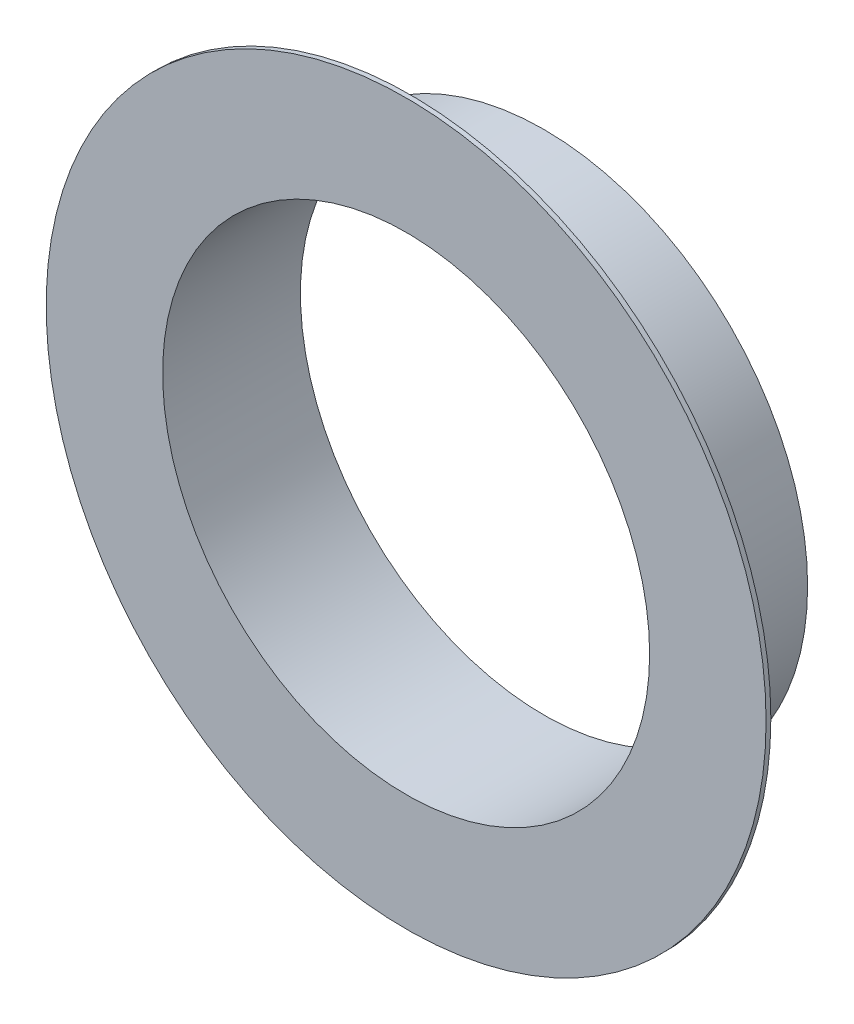
ISO-10303-21;
HEADER;
FILE_DESCRIPTION(('STEP AP214'),'2;1');
FILE_NAME('part.step','',(''),(''),'','','');
FILE_SCHEMA(('AUTOMOTIVE_DESIGN { 1 0 10303 214 1 1 1 1 }'));
ENDSEC;
DATA;
#1=APPLICATION_CONTEXT('core data for automotive mechanical design processes');
#2=APPLICATION_PROTOCOL_DEFINITION('international standard','automotive_design',2000,#1);
#3=PRODUCT_CONTEXT('',#1,'mechanical');
#4=PRODUCT('Part','Part','',(#3));
#5=PRODUCT_RELATED_PRODUCT_CATEGORY('part','',(#4));
#6=PRODUCT_DEFINITION_FORMATION('','',#4);
#7=PRODUCT_DEFINITION_CONTEXT('part definition',#1,'design');
#8=PRODUCT_DEFINITION('design','',#6,#7);
#9=PRODUCT_DEFINITION_SHAPE('','',#8);
#10=(LENGTH_UNIT() NAMED_UNIT(*) SI_UNIT(.MILLI.,.METRE.));
#11=(NAMED_UNIT(*) PLANE_ANGLE_UNIT() SI_UNIT($,.RADIAN.));
#12=(NAMED_UNIT(*) SI_UNIT($,.STERADIAN.) SOLID_ANGLE_UNIT());
#13=UNCERTAINTY_MEASURE_WITH_UNIT(LENGTH_MEASURE(1.E-05),#10,'distance_accuracy_value','');
#14=(GEOMETRIC_REPRESENTATION_CONTEXT(3) GLOBAL_UNCERTAINTY_ASSIGNED_CONTEXT((#13)) GLOBAL_UNIT_ASSIGNED_CONTEXT((#10,
#11,#12)) REPRESENTATION_CONTEXT('',''));
#15=CARTESIAN_POINT('',(0.,0.,0.));
#16=DIRECTION('',(0.,0.,1.));
#17=DIRECTION('',(1.,0.,0.));
#18=AXIS2_PLACEMENT_3D('',#15,#16,#17);
#19=CARTESIAN_POINT('',(0.,0.,58.));
#20=DIRECTION('',(0.,0.,1.));
#21=DIRECTION('',(1.,0.,0.));
#22=AXIS2_PLACEMENT_3D('',#19,#20,#21);
#23=PLANE('',#22);
#24=CARTESIAN_POINT('',(0.,0.,58.));
#25=DIRECTION('',(0.,0.,1.));
#26=DIRECTION('',(1.,0.,0.));
#27=AXIS2_PLACEMENT_3D('',#24,#25,#26);
#28=CIRCLE('',#27,151.521158387346);
#29=CARTESIAN_POINT('',(151.521158387346,0.,58.));
#30=VERTEX_POINT('',#29);
#31=EDGE_CURVE('E56',#30,#30,#28,.T.);
#32=ORIENTED_EDGE('',*,*,#31,.T.);
#33=EDGE_LOOP('',(#32));
#34=FACE_BOUND('',#33,.T.);
#35=CARTESIAN_POINT('',(0.,0.,58.));
#36=DIRECTION('',(0.,0.,1.));
#37=DIRECTION('',(1.,0.,0.));
#38=AXIS2_PLACEMENT_3D('',#35,#36,#37);
#39=CIRCLE('',#38,102.5);
#40=CARTESIAN_POINT('',(102.5,0.,58.));
#41=VERTEX_POINT('',#40);
#42=EDGE_CURVE('E103',#41,#41,#39,.T.);
#43=ORIENTED_EDGE('',*,*,#42,.F.);
#44=EDGE_LOOP('',(#43));
#45=FACE_BOUND('',#44,.T.);
#46=ADVANCED_FACE('F35',(#34,#45),#23,.T.);
#47=CARTESIAN_POINT('',(0.,0.,56.));
#48=DIRECTION('',(0.,0.,1.));
#49=DIRECTION('',(1.,0.,0.));
#50=AXIS2_PLACEMENT_3D('',#47,#48,#49);
#51=PLANE('',#50);
#52=CARTESIAN_POINT('',(0.,0.,56.));
#53=DIRECTION('',(0.,0.,1.));
#54=DIRECTION('',(1.,0.,0.));
#55=AXIS2_PLACEMENT_3D('',#52,#53,#54);
#56=CIRCLE('',#55,111.);
#57=CARTESIAN_POINT('',(111.,0.,56.));
#58=VERTEX_POINT('',#57);
#59=EDGE_CURVE('E10',#58,#58,#56,.T.);
#60=ORIENTED_EDGE('',*,*,#59,.T.);
#61=EDGE_LOOP('',(#60));
#62=FACE_BOUND('',#61,.T.);
#63=CARTESIAN_POINT('',(0.,0.,56.));
#64=DIRECTION('',(0.,0.,1.));
#65=DIRECTION('',(1.,0.,0.));
#66=AXIS2_PLACEMENT_3D('',#63,#64,#65);
#67=CIRCLE('',#66,151.521158387346);
#68=CARTESIAN_POINT('',(151.521158387346,0.,56.));
#69=VERTEX_POINT('',#68);
#70=EDGE_CURVE('E100',#69,#69,#67,.T.);
#71=ORIENTED_EDGE('',*,*,#70,.F.);
#72=EDGE_LOOP('',(#71));
#73=FACE_BOUND('',#72,.T.);
#74=ADVANCED_FACE('F112',(#62,#73),#51,.F.);
#75=CARTESIAN_POINT('',(0.,0.,58.));
#76=DIRECTION('',(0.,0.,-1.));
#77=DIRECTION('',(-1.,0.,0.));
#78=AXIS2_PLACEMENT_3D('',#75,#76,#77);
#79=CYLINDRICAL_SURFACE('',#78,151.521158387346);
#80=ORIENTED_EDGE('',*,*,#31,.F.);
#81=EDGE_LOOP('',(#80));
#82=FACE_BOUND('',#81,.T.);
#83=ORIENTED_EDGE('',*,*,#70,.T.);
#84=EDGE_LOOP('',(#83));
#85=FACE_BOUND('',#84,.T.);
#86=ADVANCED_FACE('F118',(#82,#85),#79,.T.);
#87=CARTESIAN_POINT('',(0.,0.,56.));
#88=DIRECTION('',(0.,0.,-1.));
#89=DIRECTION('',(-1.,0.,0.));
#90=AXIS2_PLACEMENT_3D('',#87,#88,#89);
#91=CYLINDRICAL_SURFACE('',#90,102.5);
#92=CARTESIAN_POINT('',(0.,0.,0.));
#93=DIRECTION('',(0.,0.,1.));
#94=DIRECTION('',(1.,0.,0.));
#95=AXIS2_PLACEMENT_3D('',#92,#93,#94);
#96=CIRCLE('',#95,102.5);
#97=CARTESIAN_POINT('',(102.5,0.,0.));
#98=VERTEX_POINT('',#97);
#99=EDGE_CURVE('E47',#98,#98,#96,.T.);
#100=ORIENTED_EDGE('',*,*,#99,.F.);
#101=EDGE_LOOP('',(#100));
#102=FACE_BOUND('',#101,.T.);
#103=ORIENTED_EDGE('',*,*,#42,.T.);
#104=EDGE_LOOP('',(#103));
#105=FACE_BOUND('',#104,.T.);
#106=ADVANCED_FACE('F109',(#102,#105),#91,.F.);
#107=CARTESIAN_POINT('',(0.,0.,0.));
#108=DIRECTION('',(0.,0.,1.));
#109=DIRECTION('',(1.,0.,0.));
#110=AXIS2_PLACEMENT_3D('',#107,#108,#109);
#111=PLANE('',#110);
#112=CARTESIAN_POINT('',(0.,0.,0.));
#113=DIRECTION('',(0.,0.,1.));
#114=DIRECTION('',(1.,0.,0.));
#115=AXIS2_PLACEMENT_3D('',#112,#113,#114);
#116=CIRCLE('',#115,111.);
#117=CARTESIAN_POINT('',(111.,0.,0.));
#118=VERTEX_POINT('',#117);
#119=EDGE_CURVE('E39',#118,#118,#116,.T.);
#120=ORIENTED_EDGE('',*,*,#119,.F.);
#121=EDGE_LOOP('',(#120));
#122=FACE_BOUND('',#121,.T.);
#123=ORIENTED_EDGE('',*,*,#99,.T.);
#124=EDGE_LOOP('',(#123));
#125=FACE_BOUND('',#124,.T.);
#126=ADVANCED_FACE('F212',(#122,#125),#111,.F.);
#127=CARTESIAN_POINT('',(0.,0.,56.));
#128=DIRECTION('',(0.,0.,-1.));
#129=DIRECTION('',(-1.,0.,0.));
#130=AXIS2_PLACEMENT_3D('',#127,#128,#129);
#131=CYLINDRICAL_SURFACE('',#130,111.);
#132=ORIENTED_EDGE('',*,*,#59,.F.);
#133=EDGE_LOOP('',(#132));
#134=FACE_BOUND('',#133,.T.);
#135=ORIENTED_EDGE('',*,*,#119,.T.);
#136=EDGE_LOOP('',(#135));
#137=FACE_BOUND('',#136,.T.);
#138=ADVANCED_FACE('F37',(#134,#137),#131,.T.);
#139=CLOSED_SHELL('',(#46,#74,#86,#106,#126,#138));
#140=CARTESIAN_POINT('',(-102.263864137179,29.4395140577255,41.));
#141=DIRECTION('',(0.,0.,1.));
#142=DIRECTION('',(0.,1.,0.));
#143=AXIS2_PLACEMENT_3D('',#140,#141,#142);
#144=PLANE('',#143);
#145=CARTESIAN_POINT('',(-102.263864137179,29.4395140577255,41.));
#146=DIRECTION('',(0.,0.,1.));
#147=DIRECTION('',(0.,1.,0.));
#148=AXIS2_PLACEMENT_3D('',#145,#146,#147);
#149=CIRCLE('',#148,2.54473142682005);
#150=CARTESIAN_POINT('',(-102.263864137179,31.9842454845455,41.));
#151=VERTEX_POINT('',#150);
#152=EDGE_CURVE('E69',#151,#151,#149,.T.);
#153=ORIENTED_EDGE('',*,*,#152,.T.);
#154=EDGE_LOOP('',(#153));
#155=FACE_BOUND('',#154,.T.);
#156=ADVANCED_FACE('F170',(#155),#144,.T.);
#157=CARTESIAN_POINT('',(-102.263864137179,29.4395140577255,41.));
#158=DIRECTION('',(0.,0.,1.));
#159=DIRECTION('',(0.,1.,0.));
#160=AXIS2_PLACEMENT_3D('',#157,#158,#159);
#161=CYLINDRICAL_SURFACE('',#160,2.54473142682005);
#162=ORIENTED_EDGE('',*,*,#152,.F.);
#163=EDGE_LOOP('',(#162));
#164=FACE_BOUND('',#163,.T.);
#165=CARTESIAN_POINT('',(-102.263864137179,29.4395140577255,56.));
#166=DIRECTION('',(0.,0.,1.));
#167=DIRECTION('',(0.,1.,0.));
#168=AXIS2_PLACEMENT_3D('',#165,#166,#167);
#169=CIRCLE('',#168,2.54473142682005);
#170=CARTESIAN_POINT('',(-102.263864137179,31.9842454845455,56.));
#171=VERTEX_POINT('',#170);
#172=EDGE_CURVE('E73',#171,#171,#169,.T.);
#173=ORIENTED_EDGE('',*,*,#172,.T.);
#174=EDGE_LOOP('',(#173));
#175=FACE_BOUND('',#174,.T.);
#176=ADVANCED_FACE('F173',(#164,#175),#161,.F.);
#177=ORIENTED_EDGE('',*,*,#172,.F.);
#178=EDGE_LOOP('',(#177));
#179=FACE_BOUND('',#178,.T.);
#180=ADVANCED_FACE('F178',(#179),#51,.F.);
#181=CLOSED_SHELL('',(#156,#176,#180));
#182=CARTESIAN_POINT('',(-93.1283518267933,-51.4945917766849,41.));
#183=DIRECTION('',(0.,0.,1.));
#184=DIRECTION('',(-0.707106781186541,0.707106781186554,0.));
#185=AXIS2_PLACEMENT_3D('',#182,#183,#184);
#186=PLANE('',#185);
#187=CARTESIAN_POINT('',(-93.1283518267933,-51.4945917766849,41.));
#188=DIRECTION('',(0.,0.,1.));
#189=DIRECTION('',(-0.707106781186541,0.707106781186554,0.));
#190=AXIS2_PLACEMENT_3D('',#187,#188,#189);
#191=CIRCLE('',#190,2.54473142682005);
#192=CARTESIAN_POINT('',(-94.9277486749963,-49.6951949284819,41.));
#193=VERTEX_POINT('',#192);
#194=EDGE_CURVE('E76',#193,#193,#191,.T.);
#195=ORIENTED_EDGE('',*,*,#194,.T.);
#196=EDGE_LOOP('',(#195));
#197=FACE_BOUND('',#196,.T.);
#198=ADVANCED_FACE('F159',(#197),#186,.T.);
#199=CARTESIAN_POINT('',(-93.1283518267933,-51.4945917766849,41.));
#200=DIRECTION('',(0.,0.,1.));
#201=DIRECTION('',(-0.707106781186541,0.707106781186554,0.));
#202=AXIS2_PLACEMENT_3D('',#199,#200,#201);
#203=CYLINDRICAL_SURFACE('',#202,2.54473142682005);
#204=ORIENTED_EDGE('',*,*,#194,.F.);
#205=EDGE_LOOP('',(#204));
#206=FACE_BOUND('',#205,.T.);
#207=CARTESIAN_POINT('',(-93.1283518267933,-51.4945917766849,56.));
#208=DIRECTION('',(0.,0.,1.));
#209=DIRECTION('',(-0.707106781186541,0.707106781186554,0.));
#210=AXIS2_PLACEMENT_3D('',#207,#208,#209);
#211=CIRCLE('',#210,2.54473142682005);
#212=CARTESIAN_POINT('',(-94.9277486749963,-49.6951949284819,56.));
#213=VERTEX_POINT('',#212);
#214=EDGE_CURVE('E79',#213,#213,#211,.T.);
#215=ORIENTED_EDGE('',*,*,#214,.T.);
#216=EDGE_LOOP('',(#215));
#217=FACE_BOUND('',#216,.T.);
#218=ADVANCED_FACE('F162',(#206,#217),#203,.F.);
#219=ORIENTED_EDGE('',*,*,#214,.F.);
#220=EDGE_LOOP('',(#219));
#221=FACE_BOUND('',#220,.T.);
#222=ADVANCED_FACE('F168',(#221),#51,.F.);
#223=CLOSED_SHELL('',(#198,#218,#222));
#224=CARTESIAN_POINT('',(-29.4395140577244,-102.263864137179,41.));
#225=DIRECTION('',(0.,0.,1.));
#226=DIRECTION('',(-1.,0.,0.));
#227=AXIS2_PLACEMENT_3D('',#224,#225,#226);
#228=PLANE('',#227);
#229=CARTESIAN_POINT('',(-29.4395140577244,-102.263864137179,41.));
#230=DIRECTION('',(0.,0.,1.));
#231=DIRECTION('',(-1.,0.,0.));
#232=AXIS2_PLACEMENT_3D('',#229,#230,#231);
#233=CIRCLE('',#232,2.54473142682005);
#234=CARTESIAN_POINT('',(-31.9842454845444,-102.263864137179,41.));
#235=VERTEX_POINT('',#234);
#236=EDGE_CURVE('E82',#235,#235,#233,.T.);
#237=ORIENTED_EDGE('',*,*,#236,.T.);
#238=EDGE_LOOP('',(#237));
#239=FACE_BOUND('',#238,.T.);
#240=ADVANCED_FACE('F148',(#239),#228,.T.);
#241=CARTESIAN_POINT('',(-29.4395140577244,-102.263864137179,41.));
#242=DIRECTION('',(0.,0.,1.));
#243=DIRECTION('',(-1.,0.,0.));
#244=AXIS2_PLACEMENT_3D('',#241,#242,#243);
#245=CYLINDRICAL_SURFACE('',#244,2.54473142682005);
#246=ORIENTED_EDGE('',*,*,#236,.F.);
#247=EDGE_LOOP('',(#246));
#248=FACE_BOUND('',#247,.T.);
#249=CARTESIAN_POINT('',(-29.4395140577244,-102.263864137179,56.));
#250=DIRECTION('',(0.,0.,1.));
#251=DIRECTION('',(-1.,0.,0.));
#252=AXIS2_PLACEMENT_3D('',#249,#250,#251);
#253=CIRCLE('',#252,2.54473142682005);
#254=CARTESIAN_POINT('',(-31.9842454845444,-102.263864137179,56.));
#255=VERTEX_POINT('',#254);
#256=EDGE_CURVE('E85',#255,#255,#253,.T.);
#257=ORIENTED_EDGE('',*,*,#256,.T.);
#258=EDGE_LOOP('',(#257));
#259=FACE_BOUND('',#258,.T.);
#260=ADVANCED_FACE('F151',(#248,#259),#245,.F.);
#261=ORIENTED_EDGE('',*,*,#256,.F.);
#262=EDGE_LOOP('',(#261));
#263=FACE_BOUND('',#262,.T.);
#264=ADVANCED_FACE('F157',(#263),#51,.F.);
#265=CLOSED_SHELL('',(#240,#260,#264));
#266=CARTESIAN_POINT('',(51.4945917766852,-93.1283518267932,41.));
#267=DIRECTION('',(0.,0.,1.));
#268=DIRECTION('',(-0.707106781186551,-0.707106781186544,0.));
#269=AXIS2_PLACEMENT_3D('',#266,#267,#268);
#270=PLANE('',#269);
#271=CARTESIAN_POINT('',(51.4945917766852,-93.1283518267932,41.));
#272=DIRECTION('',(0.,0.,1.));
#273=DIRECTION('',(-0.707106781186551,-0.707106781186544,0.));
#274=AXIS2_PLACEMENT_3D('',#271,#272,#273);
#275=CIRCLE('',#274,2.54473142682005);
#276=CARTESIAN_POINT('',(49.6951949284822,-94.9277486749962,41.));
#277=VERTEX_POINT('',#276);
#278=EDGE_CURVE('E88',#277,#277,#275,.T.);
#279=ORIENTED_EDGE('',*,*,#278,.T.);
#280=EDGE_LOOP('',(#279));
#281=FACE_BOUND('',#280,.T.);
#282=ADVANCED_FACE('F137',(#281),#270,.T.);
#283=CARTESIAN_POINT('',(51.4945917766852,-93.1283518267932,41.));
#284=DIRECTION('',(0.,0.,1.));
#285=DIRECTION('',(-0.707106781186551,-0.707106781186544,0.));
#286=AXIS2_PLACEMENT_3D('',#283,#284,#285);
#287=CYLINDRICAL_SURFACE('',#286,2.54473142682005);
#288=ORIENTED_EDGE('',*,*,#278,.F.);
#289=EDGE_LOOP('',(#288));
#290=FACE_BOUND('',#289,.T.);
#291=CARTESIAN_POINT('',(51.4945917766852,-93.1283518267932,56.));
#292=DIRECTION('',(0.,0.,1.));
#293=DIRECTION('',(-0.707106781186551,-0.707106781186544,0.));
#294=AXIS2_PLACEMENT_3D('',#291,#292,#293);
#295=CIRCLE('',#294,2.54473142682005);
#296=CARTESIAN_POINT('',(49.6951949284822,-94.9277486749962,56.));
#297=VERTEX_POINT('',#296);
#298=EDGE_CURVE('E91',#297,#297,#295,.T.);
#299=ORIENTED_EDGE('',*,*,#298,.T.);
#300=EDGE_LOOP('',(#299));
#301=FACE_BOUND('',#300,.T.);
#302=ADVANCED_FACE('F140',(#290,#301),#287,.F.);
#303=ORIENTED_EDGE('',*,*,#298,.F.);
#304=EDGE_LOOP('',(#303));
#305=FACE_BOUND('',#304,.T.);
#306=ADVANCED_FACE('F146',(#305),#51,.F.);
#307=CLOSED_SHELL('',(#282,#302,#306));
#308=CARTESIAN_POINT('',(102.263864137179,-29.4395140577247,41.));
#309=DIRECTION('',(0.,0.,1.));
#310=DIRECTION('',(0.,-1.,0.));
#311=AXIS2_PLACEMENT_3D('',#308,#309,#310);
#312=PLANE('',#311);
#313=CARTESIAN_POINT('',(102.263864137179,-29.4395140577247,41.));
#314=DIRECTION('',(0.,0.,1.));
#315=DIRECTION('',(0.,-1.,0.));
#316=AXIS2_PLACEMENT_3D('',#313,#314,#315);
#317=CIRCLE('',#316,2.54473142682005);
#318=CARTESIAN_POINT('',(102.263864137179,-31.9842454845448,41.));
#319=VERTEX_POINT('',#318);
#320=EDGE_CURVE('E62',#319,#319,#317,.T.);
#321=ORIENTED_EDGE('',*,*,#320,.T.);
#322=EDGE_LOOP('',(#321));
#323=FACE_BOUND('',#322,.T.);
#324=ADVANCED_FACE('F126',(#323),#312,.T.);
#325=CARTESIAN_POINT('',(102.263864137179,-29.4395140577247,41.));
#326=DIRECTION('',(0.,0.,1.));
#327=DIRECTION('',(0.,-1.,0.));
#328=AXIS2_PLACEMENT_3D('',#325,#326,#327);
#329=CYLINDRICAL_SURFACE('',#328,2.54473142682005);
#330=ORIENTED_EDGE('',*,*,#320,.F.);
#331=EDGE_LOOP('',(#330));
#332=FACE_BOUND('',#331,.T.);
#333=CARTESIAN_POINT('',(102.263864137179,-29.4395140577247,56.));
#334=DIRECTION('',(0.,0.,1.));
#335=DIRECTION('',(0.,-1.,0.));
#336=AXIS2_PLACEMENT_3D('',#333,#334,#335);
#337=CIRCLE('',#336,2.54473142682005);
#338=CARTESIAN_POINT('',(102.263864137179,-31.9842454845448,56.));
#339=VERTEX_POINT('',#338);
#340=EDGE_CURVE('E65',#339,#339,#337,.T.);
#341=ORIENTED_EDGE('',*,*,#340,.T.);
#342=EDGE_LOOP('',(#341));
#343=FACE_BOUND('',#342,.T.);
#344=ADVANCED_FACE('F129',(#332,#343),#329,.F.);
#345=ORIENTED_EDGE('',*,*,#340,.F.);
#346=EDGE_LOOP('',(#345));
#347=FACE_BOUND('',#346,.T.);
#348=ADVANCED_FACE('F135',(#347),#51,.F.);
#349=CLOSED_SHELL('',(#324,#344,#348));
#350=CARTESIAN_POINT('',(93.128351826793,51.4945917766855,41.));
#351=DIRECTION('',(0.,0.,1.));
#352=DIRECTION('',(0.707106781186546,-0.707106781186549,0.));
#353=AXIS2_PLACEMENT_3D('',#350,#351,#352);
#354=PLANE('',#353);
#355=CARTESIAN_POINT('',(93.128351826793,51.4945917766855,41.));
#356=DIRECTION('',(0.,0.,1.));
#357=DIRECTION('',(0.707106781186546,-0.707106781186549,0.));
#358=AXIS2_PLACEMENT_3D('',#355,#356,#357);
#359=CIRCLE('',#358,2.54473142682005);
#360=CARTESIAN_POINT('',(94.927748674996,49.6951949284826,41.));
#361=VERTEX_POINT('',#360);
#362=EDGE_CURVE('E59',#361,#361,#359,.T.);
#363=ORIENTED_EDGE('',*,*,#362,.T.);
#364=EDGE_LOOP('',(#363));
#365=FACE_BOUND('',#364,.T.);
#366=ADVANCED_FACE('F190',(#365),#354,.T.);
#367=CARTESIAN_POINT('',(93.128351826793,51.4945917766855,41.));
#368=DIRECTION('',(0.,0.,1.));
#369=DIRECTION('',(0.707106781186546,-0.707106781186549,0.));
#370=AXIS2_PLACEMENT_3D('',#367,#368,#369);
#371=CYLINDRICAL_SURFACE('',#370,2.54473142682005);
#372=ORIENTED_EDGE('',*,*,#362,.F.);
#373=EDGE_LOOP('',(#372));
#374=FACE_BOUND('',#373,.T.);
#375=CARTESIAN_POINT('',(93.128351826793,51.4945917766855,56.));
#376=DIRECTION('',(0.,0.,1.));
#377=DIRECTION('',(0.707106781186546,-0.707106781186549,0.));
#378=AXIS2_PLACEMENT_3D('',#375,#376,#377);
#379=CIRCLE('',#378,2.54473142682005);
#380=CARTESIAN_POINT('',(94.927748674996,49.6951949284826,56.));
#381=VERTEX_POINT('',#380);
#382=EDGE_CURVE('E55',#381,#381,#379,.T.);
#383=ORIENTED_EDGE('',*,*,#382,.T.);
#384=EDGE_LOOP('',(#383));
#385=FACE_BOUND('',#384,.T.);
#386=ADVANCED_FACE('F193',(#374,#385),#371,.F.);
#387=ORIENTED_EDGE('',*,*,#382,.F.);
#388=EDGE_LOOP('',(#387));
#389=FACE_BOUND('',#388,.T.);
#390=ADVANCED_FACE('F199',(#389),#51,.F.);
#391=CLOSED_SHELL('',(#366,#386,#390));
#392=CARTESIAN_POINT('',(29.4395140577244,102.263864137179,41.));
#393=DIRECTION('',(0.,0.,1.));
#394=DIRECTION('',(1.,0.,0.));
#395=AXIS2_PLACEMENT_3D('',#392,#393,#394);
#396=PLANE('',#395);
#397=CARTESIAN_POINT('',(29.4395140577244,102.263864137179,41.));
#398=DIRECTION('',(0.,0.,1.));
#399=DIRECTION('',(1.,0.,0.));
#400=AXIS2_PLACEMENT_3D('',#397,#398,#399);
#401=CIRCLE('',#400,2.54473142682005);
#402=CARTESIAN_POINT('',(31.9842454845444,102.263864137179,41.));
#403=VERTEX_POINT('',#402);
#404=EDGE_CURVE('E51',#403,#403,#401,.T.);
#405=ORIENTED_EDGE('',*,*,#404,.T.);
#406=EDGE_LOOP('',(#405));
#407=FACE_BOUND('',#406,.T.);
#408=ADVANCED_FACE('F201',(#407),#396,.T.);
#409=CARTESIAN_POINT('',(29.4395140577244,102.263864137179,41.));
#410=DIRECTION('',(0.,0.,1.));
#411=DIRECTION('',(1.,0.,0.));
#412=AXIS2_PLACEMENT_3D('',#409,#410,#411);
#413=CYLINDRICAL_SURFACE('',#412,2.54473142682005);
#414=ORIENTED_EDGE('',*,*,#404,.F.);
#415=EDGE_LOOP('',(#414));
#416=FACE_BOUND('',#415,.T.);
#417=CARTESIAN_POINT('',(29.4395140577244,102.263864137179,56.));
#418=DIRECTION('',(0.,0.,1.));
#419=DIRECTION('',(1.,0.,0.));
#420=AXIS2_PLACEMENT_3D('',#417,#418,#419);
#421=CIRCLE('',#420,2.54473142682005);
#422=CARTESIAN_POINT('',(31.9842454845444,102.263864137179,56.));
#423=VERTEX_POINT('',#422);
#424=EDGE_CURVE('E52',#423,#423,#421,.T.);
#425=ORIENTED_EDGE('',*,*,#424,.T.);
#426=EDGE_LOOP('',(#425));
#427=FACE_BOUND('',#426,.T.);
#428=ADVANCED_FACE('F204',(#416,#427),#413,.F.);
#429=ORIENTED_EDGE('',*,*,#424,.F.);
#430=EDGE_LOOP('',(#429));
#431=FACE_BOUND('',#430,.T.);
#432=ADVANCED_FACE('F121',(#431),#51,.F.);
#433=CLOSED_SHELL('',(#408,#428,#432));
#434=CARTESIAN_POINT('',(-51.4945917766846,93.1283518267935,41.));
#435=DIRECTION('',(0.,0.,1.));
#436=DIRECTION('',(0.707106781186556,0.707106781186539,0.));
#437=AXIS2_PLACEMENT_3D('',#434,#435,#436);
#438=CYLINDRICAL_SURFACE('',#437,2.54473142682005);
#439=CARTESIAN_POINT('',(-51.4945917766846,93.1283518267935,41.));
#440=DIRECTION('',(0.,0.,1.));
#441=DIRECTION('',(0.707106781186556,0.707106781186539,0.));
#442=AXIS2_PLACEMENT_3D('',#439,#440,#441);
#443=CIRCLE('',#442,2.54473142682005);
#444=CARTESIAN_POINT('',(-49.6951949284816,94.9277486749965,41.));
#445=VERTEX_POINT('',#444);
#446=EDGE_CURVE('E66',#445,#445,#443,.T.);
#447=ORIENTED_EDGE('',*,*,#446,.F.);
#448=EDGE_LOOP('',(#447));
#449=FACE_BOUND('',#448,.T.);
#450=CARTESIAN_POINT('',(-51.4945917766846,93.1283518267935,56.));
#451=DIRECTION('',(0.,0.,1.));
#452=DIRECTION('',(0.707106781186556,0.707106781186539,0.));
#453=AXIS2_PLACEMENT_3D('',#450,#451,#452);
#454=CIRCLE('',#453,2.54473142682005);
#455=CARTESIAN_POINT('',(-49.6951949284816,94.9277486749965,56.));
#456=VERTEX_POINT('',#455);
#457=EDGE_CURVE('E70',#456,#456,#454,.T.);
#458=ORIENTED_EDGE('',*,*,#457,.T.);
#459=EDGE_LOOP('',(#458));
#460=FACE_BOUND('',#459,.T.);
#461=ADVANCED_FACE('F183',(#449,#460),#438,.F.);
#462=CARTESIAN_POINT('',(-51.4945917766846,93.1283518267935,41.));
#463=DIRECTION('',(0.,0.,1.));
#464=DIRECTION('',(0.707106781186556,0.707106781186539,0.));
#465=AXIS2_PLACEMENT_3D('',#462,#463,#464);
#466=PLANE('',#465);
#467=ORIENTED_EDGE('',*,*,#446,.T.);
#468=EDGE_LOOP('',(#467));
#469=FACE_BOUND('',#468,.T.);
#470=ADVANCED_FACE('F180',(#469),#466,.T.);
#471=ORIENTED_EDGE('',*,*,#457,.F.);
#472=EDGE_LOOP('',(#471));
#473=FACE_BOUND('',#472,.T.);
#474=ADVANCED_FACE('F120',(#473),#51,.F.);
#475=CLOSED_SHELL('',(#461,#470,#474));
#476=ORIENTED_CLOSED_SHELL('',*,#181,.T.);
#477=ORIENTED_CLOSED_SHELL('',*,#223,.T.);
#478=ORIENTED_CLOSED_SHELL('',*,#265,.T.);
#479=ORIENTED_CLOSED_SHELL('',*,#307,.T.);
#480=ORIENTED_CLOSED_SHELL('',*,#349,.T.);
#481=ORIENTED_CLOSED_SHELL('',*,#391,.T.);
#482=ORIENTED_CLOSED_SHELL('',*,#433,.T.);
#483=ORIENTED_CLOSED_SHELL('',*,#475,.T.);
#484=BREP_WITH_VOIDS('B2',#139,(#476,#477,#478,#479,#480,#481,#482,#483));
#485=ADVANCED_BREP_SHAPE_REPRESENTATION('',(#18,#484),#14);
#486=SHAPE_DEFINITION_REPRESENTATION(#9,#485);
ENDSEC;
END-ISO-10303-21;
